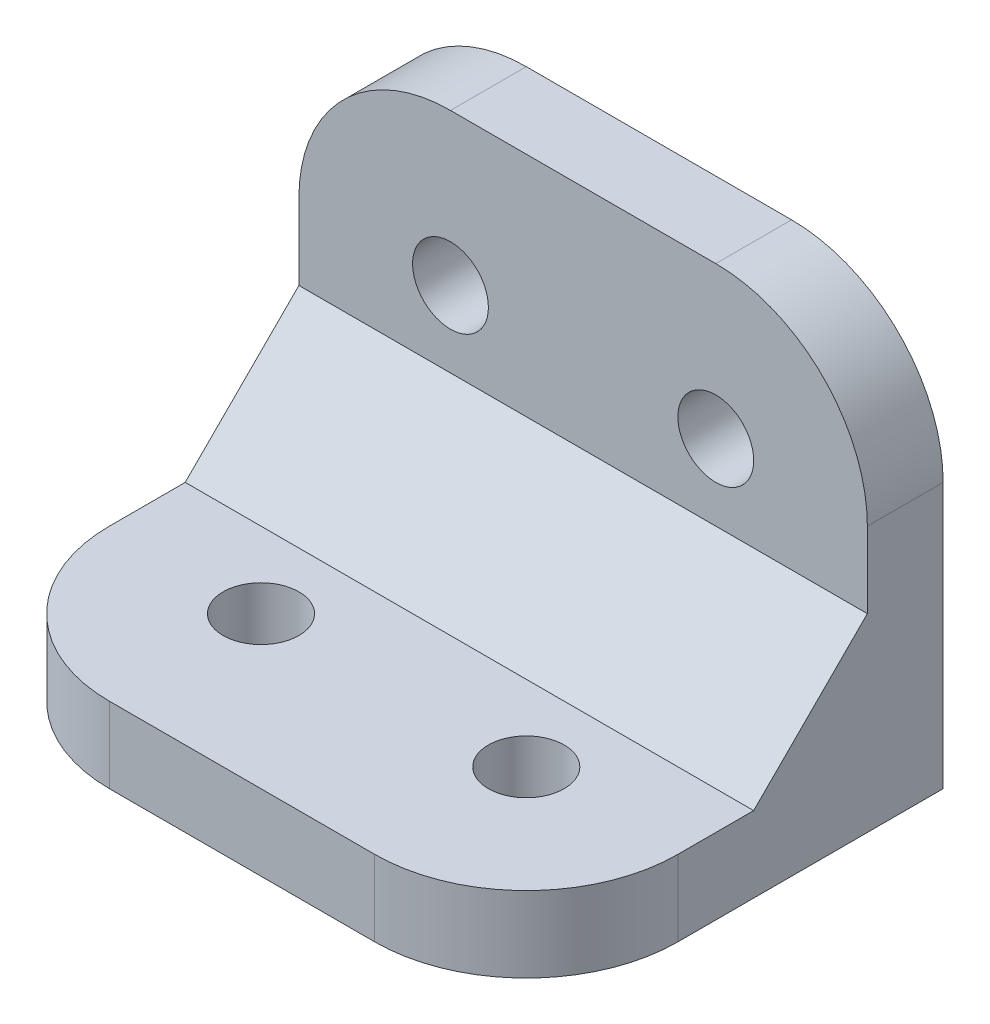
ISO-10303-21;
HEADER;
FILE_DESCRIPTION(('STEP AP214'),'2;1');
FILE_NAME('part.step','',(''),(''),'','','');
FILE_SCHEMA(('AUTOMOTIVE_DESIGN { 1 0 10303 214 1 1 1 1 }'));
ENDSEC;
DATA;
#1=APPLICATION_CONTEXT('core data for automotive mechanical design processes');
#2=APPLICATION_PROTOCOL_DEFINITION('international standard','automotive_design',2000,#1);
#3=PRODUCT_CONTEXT('',#1,'mechanical');
#4=PRODUCT('Part','Part','',(#3));
#5=PRODUCT_RELATED_PRODUCT_CATEGORY('part','',(#4));
#6=PRODUCT_DEFINITION_FORMATION('','',#4);
#7=PRODUCT_DEFINITION_CONTEXT('part definition',#1,'design');
#8=PRODUCT_DEFINITION('design','',#6,#7);
#9=PRODUCT_DEFINITION_SHAPE('','',#8);
#10=(LENGTH_UNIT() NAMED_UNIT(*) SI_UNIT(.MILLI.,.METRE.));
#11=(NAMED_UNIT(*) PLANE_ANGLE_UNIT() SI_UNIT($,.RADIAN.));
#12=(NAMED_UNIT(*) SI_UNIT($,.STERADIAN.) SOLID_ANGLE_UNIT());
#13=UNCERTAINTY_MEASURE_WITH_UNIT(LENGTH_MEASURE(1.E-05),#10,'distance_accuracy_value','');
#14=(GEOMETRIC_REPRESENTATION_CONTEXT(3) GLOBAL_UNCERTAINTY_ASSIGNED_CONTEXT((#13)) GLOBAL_UNIT_ASSIGNED_CONTEXT((#10,
#11,#12)) REPRESENTATION_CONTEXT('',''));
#15=CARTESIAN_POINT('',(0.,0.,0.));
#16=DIRECTION('',(0.,0.,1.));
#17=DIRECTION('',(1.,0.,0.));
#18=AXIS2_PLACEMENT_3D('',#15,#16,#17);
#19=CARTESIAN_POINT('',(0.,4.,0.));
#20=DIRECTION('',(1.,0.,0.));
#21=DIRECTION('',(0.,0.,-1.));
#22=AXIS2_PLACEMENT_3D('',#19,#20,#21);
#23=PLANE('',#22);
#24=DIRECTION('',(0.,0.,1.));
#25=VECTOR('',#24,1.);
#26=CARTESIAN_POINT('',(0.,0.,0.));
#27=LINE('',#26,#25);
#28=CARTESIAN_POINT('',(0.,0.,0.));
#29=VERTEX_POINT('',#28);
#30=CARTESIAN_POINT('',(0.,0.,14.));
#31=VERTEX_POINT('',#30);
#32=EDGE_CURVE('E147',#29,#31,#27,.T.);
#33=ORIENTED_EDGE('',*,*,#32,.T.);
#34=DIRECTION('',(0.,-1.,0.));
#35=VECTOR('',#34,1.);
#36=CARTESIAN_POINT('',(0.,4.,14.));
#37=LINE('',#36,#35);
#38=CARTESIAN_POINT('',(0.,4.,14.));
#39=VERTEX_POINT('',#38);
#40=EDGE_CURVE('E193',#31,#39,#37,.F.);
#41=ORIENTED_EDGE('',*,*,#40,.T.);
#42=DIRECTION('',(0.,0.,1.));
#43=VECTOR('',#42,1.);
#44=CARTESIAN_POINT('',(0.,4.,0.));
#45=LINE('',#44,#43);
#46=CARTESIAN_POINT('',(0.,4.,9.99999999999998));
#47=VERTEX_POINT('',#46);
#48=EDGE_CURVE('E148',#47,#39,#45,.T.);
#49=ORIENTED_EDGE('',*,*,#48,.F.);
#50=DIRECTION('',(0.,0.707106781186551,-0.707106781186544));
#51=VECTOR('',#50,1.);
#52=CARTESIAN_POINT('',(0.,8.99999999999999,5.00000000000004));
#53=LINE('',#52,#51);
#54=CARTESIAN_POINT('',(0.,10.,4.));
#55=VERTEX_POINT('',#54);
#56=EDGE_CURVE('E172',#47,#55,#53,.T.);
#57=ORIENTED_EDGE('',*,*,#56,.T.);
#58=DIRECTION('',(0.,-1.,0.));
#59=VECTOR('',#58,1.);
#60=CARTESIAN_POINT('',(0.,22.,4.));
#61=LINE('',#60,#59);
#62=CARTESIAN_POINT('',(0.,14.,4.));
#63=VERTEX_POINT('',#62);
#64=EDGE_CURVE('E206',#63,#55,#61,.T.);
#65=ORIENTED_EDGE('',*,*,#64,.F.);
#66=DIRECTION('',(0.,0.,1.));
#67=VECTOR('',#66,1.);
#68=CARTESIAN_POINT('',(0.,14.,0.));
#69=LINE('',#68,#67);
#70=CARTESIAN_POINT('',(0.,14.,0.));
#71=VERTEX_POINT('',#70);
#72=EDGE_CURVE('E191',#63,#71,#69,.F.);
#73=ORIENTED_EDGE('',*,*,#72,.T.);
#74=DIRECTION('',(0.,-1.,0.));
#75=VECTOR('',#74,1.);
#76=CARTESIAN_POINT('',(0.,4.,0.));
#77=LINE('',#76,#75);
#78=EDGE_CURVE('E133',#71,#29,#77,.T.);
#79=ORIENTED_EDGE('',*,*,#78,.T.);
#80=EDGE_LOOP('',(#33,#41,#49,#57,#65,#73,#79));
#81=FACE_BOUND('',#80,.T.);
#82=ADVANCED_FACE('F41',(#81),#23,.F.);
#83=CARTESIAN_POINT('',(0.,4.,22.));
#84=DIRECTION('',(0.,0.,-1.));
#85=DIRECTION('',(-1.,0.,0.));
#86=AXIS2_PLACEMENT_3D('',#83,#84,#85);
#87=PLANE('',#86);
#88=DIRECTION('',(1.,0.,0.));
#89=VECTOR('',#88,1.);
#90=CARTESIAN_POINT('',(0.,0.,22.));
#91=LINE('',#90,#89);
#92=CARTESIAN_POINT('',(8.,0.,22.));
#93=VERTEX_POINT('',#92);
#94=CARTESIAN_POINT('',(22.,0.,22.));
#95=VERTEX_POINT('',#94);
#96=EDGE_CURVE('E143',#93,#95,#91,.T.);
#97=ORIENTED_EDGE('',*,*,#96,.T.);
#98=DIRECTION('',(0.,-1.,0.));
#99=VECTOR('',#98,1.);
#100=CARTESIAN_POINT('',(22.,4.,22.));
#101=LINE('',#100,#99);
#102=CARTESIAN_POINT('',(22.,4.,22.));
#103=VERTEX_POINT('',#102);
#104=EDGE_CURVE('E185',#95,#103,#101,.F.);
#105=ORIENTED_EDGE('',*,*,#104,.T.);
#106=DIRECTION('',(1.,0.,0.));
#107=VECTOR('',#106,1.);
#108=CARTESIAN_POINT('',(0.,4.,22.));
#109=LINE('',#108,#107);
#110=CARTESIAN_POINT('',(8.,4.,22.));
#111=VERTEX_POINT('',#110);
#112=EDGE_CURVE('E151',#111,#103,#109,.T.);
#113=ORIENTED_EDGE('',*,*,#112,.F.);
#114=DIRECTION('',(0.,-1.,0.));
#115=VECTOR('',#114,1.);
#116=CARTESIAN_POINT('',(8.,4.,22.));
#117=LINE('',#116,#115);
#118=EDGE_CURVE('E182',#111,#93,#117,.T.);
#119=ORIENTED_EDGE('',*,*,#118,.T.);
#120=EDGE_LOOP('',(#97,#105,#113,#119));
#121=FACE_BOUND('',#120,.T.);
#122=ADVANCED_FACE('F232',(#121),#87,.F.);
#123=CARTESIAN_POINT('',(30.,4.,0.));
#124=DIRECTION('',(-1.,0.,0.));
#125=DIRECTION('',(0.,0.,1.));
#126=AXIS2_PLACEMENT_3D('',#123,#124,#125);
#127=PLANE('',#126);
#128=DIRECTION('',(0.,0.,-1.));
#129=VECTOR('',#128,1.);
#130=CARTESIAN_POINT('',(30.,4.,0.));
#131=LINE('',#130,#129);
#132=CARTESIAN_POINT('',(30.,4.,14.));
#133=VERTEX_POINT('',#132);
#134=CARTESIAN_POINT('',(30.,4.,9.99999999999998));
#135=VERTEX_POINT('',#134);
#136=EDGE_CURVE('E155',#133,#135,#131,.T.);
#137=ORIENTED_EDGE('',*,*,#136,.F.);
#138=DIRECTION('',(0.,-1.,0.));
#139=VECTOR('',#138,1.);
#140=CARTESIAN_POINT('',(30.,4.,14.));
#141=LINE('',#140,#139);
#142=CARTESIAN_POINT('',(30.,0.,14.));
#143=VERTEX_POINT('',#142);
#144=EDGE_CURVE('E141',#133,#143,#141,.T.);
#145=ORIENTED_EDGE('',*,*,#144,.T.);
#146=DIRECTION('',(0.,0.,-1.));
#147=VECTOR('',#146,1.);
#148=CARTESIAN_POINT('',(30.,0.,0.));
#149=LINE('',#148,#147);
#150=CARTESIAN_POINT('',(30.,0.,0.));
#151=VERTEX_POINT('',#150);
#152=EDGE_CURVE('E137',#143,#151,#149,.T.);
#153=ORIENTED_EDGE('',*,*,#152,.T.);
#154=DIRECTION('',(0.,-1.,0.));
#155=VECTOR('',#154,1.);
#156=CARTESIAN_POINT('',(30.,4.,0.));
#157=LINE('',#156,#155);
#158=CARTESIAN_POINT('',(30.,14.,0.));
#159=VERTEX_POINT('',#158);
#160=EDGE_CURVE('E125',#159,#151,#157,.T.);
#161=ORIENTED_EDGE('',*,*,#160,.F.);
#162=DIRECTION('',(0.,0.,-1.));
#163=VECTOR('',#162,1.);
#164=CARTESIAN_POINT('',(30.,14.,4.));
#165=LINE('',#164,#163);
#166=CARTESIAN_POINT('',(30.,14.,4.));
#167=VERTEX_POINT('',#166);
#168=EDGE_CURVE('E175',#159,#167,#165,.F.);
#169=ORIENTED_EDGE('',*,*,#168,.T.);
#170=DIRECTION('',(0.,-1.,0.));
#171=VECTOR('',#170,1.);
#172=CARTESIAN_POINT('',(30.,22.,4.));
#173=LINE('',#172,#171);
#174=CARTESIAN_POINT('',(30.,10.,4.));
#175=VERTEX_POINT('',#174);
#176=EDGE_CURVE('E215',#167,#175,#173,.T.);
#177=ORIENTED_EDGE('',*,*,#176,.T.);
#178=DIRECTION('',(0.,-0.707106781186551,0.707106781186544));
#179=VECTOR('',#178,1.);
#180=CARTESIAN_POINT('',(30.,8.99999999999999,5.00000000000004));
#181=LINE('',#180,#179);
#182=EDGE_CURVE('E169',#175,#135,#181,.T.);
#183=ORIENTED_EDGE('',*,*,#182,.T.);
#184=EDGE_LOOP('',(#137,#145,#153,#161,#169,#177,#183));
#185=FACE_BOUND('',#184,.T.);
#186=ADVANCED_FACE('F139',(#185),#127,.F.);
#187=CARTESIAN_POINT('',(0.,4.,0.));
#188=DIRECTION('',(0.,0.,1.));
#189=DIRECTION('',(1.,0.,0.));
#190=AXIS2_PLACEMENT_3D('',#187,#188,#189);
#191=PLANE('',#190);
#192=CARTESIAN_POINT('',(8.,14.,0.));
#193=DIRECTION('',(0.,0.,1.));
#194=DIRECTION('',(1.,0.,0.));
#195=AXIS2_PLACEMENT_3D('',#192,#193,#194);
#196=CIRCLE('',#195,2.);
#197=CARTESIAN_POINT('',(10.,14.,0.));
#198=VERTEX_POINT('',#197);
#199=EDGE_CURVE('E412',#198,#198,#196,.T.);
#200=ORIENTED_EDGE('',*,*,#199,.T.);
#201=EDGE_LOOP('',(#200));
#202=FACE_BOUND('',#201,.T.);
#203=CARTESIAN_POINT('',(22.,14.,0.));
#204=DIRECTION('',(0.,0.,1.));
#205=DIRECTION('',(1.,0.,0.));
#206=AXIS2_PLACEMENT_3D('',#203,#204,#205);
#207=CIRCLE('',#206,2.);
#208=CARTESIAN_POINT('',(24.,14.,0.));
#209=VERTEX_POINT('',#208);
#210=EDGE_CURVE('E415',#209,#209,#207,.T.);
#211=ORIENTED_EDGE('',*,*,#210,.T.);
#212=EDGE_LOOP('',(#211));
#213=FACE_BOUND('',#212,.T.);
#214=DIRECTION('',(-1.,0.,0.));
#215=VECTOR('',#214,1.);
#216=CARTESIAN_POINT('',(0.,22.,0.));
#217=LINE('',#216,#215);
#218=CARTESIAN_POINT('',(22.,22.,0.));
#219=VERTEX_POINT('',#218);
#220=CARTESIAN_POINT('',(8.,22.,0.));
#221=VERTEX_POINT('',#220);
#222=EDGE_CURVE('E219',#219,#221,#217,.T.);
#223=ORIENTED_EDGE('',*,*,#222,.F.);
#224=CARTESIAN_POINT('',(22.,14.,0.));
#225=DIRECTION('',(0.,0.,1.));
#226=DIRECTION('',(1.,0.,0.));
#227=AXIS2_PLACEMENT_3D('',#224,#225,#226);
#228=CIRCLE('',#227,8.);
#229=EDGE_CURVE('E64',#219,#159,#228,.F.);
#230=ORIENTED_EDGE('',*,*,#229,.T.);
#231=ORIENTED_EDGE('',*,*,#160,.T.);
#232=DIRECTION('',(-1.,0.,0.));
#233=VECTOR('',#232,1.);
#234=CARTESIAN_POINT('',(0.,0.,0.));
#235=LINE('',#234,#233);
#236=EDGE_CURVE('E129',#151,#29,#235,.T.);
#237=ORIENTED_EDGE('',*,*,#236,.T.);
#238=ORIENTED_EDGE('',*,*,#78,.F.);
#239=CARTESIAN_POINT('',(8.,14.,0.));
#240=DIRECTION('',(0.,0.,1.));
#241=DIRECTION('',(1.,0.,0.));
#242=AXIS2_PLACEMENT_3D('',#239,#240,#241);
#243=CIRCLE('',#242,8.);
#244=EDGE_CURVE('E56',#71,#221,#243,.F.);
#245=ORIENTED_EDGE('',*,*,#244,.T.);
#246=EDGE_LOOP('',(#223,#230,#231,#237,#238,#245));
#247=FACE_BOUND('',#246,.T.);
#248=ADVANCED_FACE('F127',(#202,#213,#247),#191,.F.);
#249=CARTESIAN_POINT('',(0.,4.,0.));
#250=DIRECTION('',(0.,1.,0.));
#251=DIRECTION('',(0.,0.,1.));
#252=AXIS2_PLACEMENT_3D('',#249,#250,#251);
#253=PLANE('',#252);
#254=CARTESIAN_POINT('',(8.,4.,14.));
#255=DIRECTION('',(0.,1.,0.));
#256=DIRECTION('',(0.,0.,1.));
#257=AXIS2_PLACEMENT_3D('',#254,#255,#256);
#258=CIRCLE('',#257,2.);
#259=CARTESIAN_POINT('',(8.,4.,16.));
#260=VERTEX_POINT('',#259);
#261=EDGE_CURVE('E161',#260,#260,#258,.T.);
#262=ORIENTED_EDGE('',*,*,#261,.F.);
#263=EDGE_LOOP('',(#262));
#264=FACE_BOUND('',#263,.T.);
#265=CARTESIAN_POINT('',(22.,4.,14.));
#266=DIRECTION('',(0.,1.,0.));
#267=DIRECTION('',(0.,0.,1.));
#268=AXIS2_PLACEMENT_3D('',#265,#266,#267);
#269=CIRCLE('',#268,2.);
#270=CARTESIAN_POINT('',(22.,4.,16.));
#271=VERTEX_POINT('',#270);
#272=EDGE_CURVE('E419',#271,#271,#269,.T.);
#273=ORIENTED_EDGE('',*,*,#272,.F.);
#274=EDGE_LOOP('',(#273));
#275=FACE_BOUND('',#274,.T.);
#276=ORIENTED_EDGE('',*,*,#112,.T.);
#277=CARTESIAN_POINT('',(22.,4.,14.));
#278=DIRECTION('',(0.,1.,0.));
#279=DIRECTION('',(0.,0.,1.));
#280=AXIS2_PLACEMENT_3D('',#277,#278,#279);
#281=CIRCLE('',#280,8.);
#282=EDGE_CURVE('E189',#103,#133,#281,.T.);
#283=ORIENTED_EDGE('',*,*,#282,.T.);
#284=ORIENTED_EDGE('',*,*,#136,.T.);
#285=DIRECTION('',(-1.,0.,0.));
#286=VECTOR('',#285,1.);
#287=CARTESIAN_POINT('',(0.,4.,9.99999999999998));
#288=LINE('',#287,#286);
#289=EDGE_CURVE('E167',#135,#47,#288,.T.);
#290=ORIENTED_EDGE('',*,*,#289,.T.);
#291=ORIENTED_EDGE('',*,*,#48,.T.);
#292=CARTESIAN_POINT('',(8.,4.,14.));
#293=DIRECTION('',(0.,1.,0.));
#294=DIRECTION('',(0.,0.,1.));
#295=AXIS2_PLACEMENT_3D('',#292,#293,#294);
#296=CIRCLE('',#295,8.);
#297=EDGE_CURVE('E187',#39,#111,#296,.T.);
#298=ORIENTED_EDGE('',*,*,#297,.T.);
#299=EDGE_LOOP('',(#276,#283,#284,#290,#291,#298));
#300=FACE_BOUND('',#299,.T.);
#301=ADVANCED_FACE('F239',(#264,#275,#300),#253,.T.);
#302=CARTESIAN_POINT('',(0.,0.,0.));
#303=DIRECTION('',(0.,1.,0.));
#304=DIRECTION('',(0.,0.,1.));
#305=AXIS2_PLACEMENT_3D('',#302,#303,#304);
#306=PLANE('',#305);
#307=CARTESIAN_POINT('',(8.,0.,14.));
#308=DIRECTION('',(0.,1.,0.));
#309=DIRECTION('',(0.,0.,1.));
#310=AXIS2_PLACEMENT_3D('',#307,#308,#309);
#311=CIRCLE('',#310,2.);
#312=CARTESIAN_POINT('',(8.,0.,16.));
#313=VERTEX_POINT('',#312);
#314=EDGE_CURVE('E160',#313,#313,#311,.T.);
#315=ORIENTED_EDGE('',*,*,#314,.T.);
#316=EDGE_LOOP('',(#315));
#317=FACE_BOUND('',#316,.T.);
#318=CARTESIAN_POINT('',(22.,0.,14.));
#319=DIRECTION('',(0.,1.,0.));
#320=DIRECTION('',(0.,0.,1.));
#321=AXIS2_PLACEMENT_3D('',#318,#319,#320);
#322=CIRCLE('',#321,2.);
#323=CARTESIAN_POINT('',(22.,0.,16.));
#324=VERTEX_POINT('',#323);
#325=EDGE_CURVE('E157',#324,#324,#322,.T.);
#326=ORIENTED_EDGE('',*,*,#325,.T.);
#327=EDGE_LOOP('',(#326));
#328=FACE_BOUND('',#327,.T.);
#329=ORIENTED_EDGE('',*,*,#152,.F.);
#330=CARTESIAN_POINT('',(22.,0.,14.));
#331=DIRECTION('',(0.,1.,0.));
#332=DIRECTION('',(0.,0.,1.));
#333=AXIS2_PLACEMENT_3D('',#330,#331,#332);
#334=CIRCLE('',#333,8.);
#335=EDGE_CURVE('E180',#143,#95,#334,.F.);
#336=ORIENTED_EDGE('',*,*,#335,.T.);
#337=ORIENTED_EDGE('',*,*,#96,.F.);
#338=CARTESIAN_POINT('',(8.,0.,14.));
#339=DIRECTION('',(0.,1.,0.));
#340=DIRECTION('',(0.,0.,1.));
#341=AXIS2_PLACEMENT_3D('',#338,#339,#340);
#342=CIRCLE('',#341,8.);
#343=EDGE_CURVE('E178',#93,#31,#342,.F.);
#344=ORIENTED_EDGE('',*,*,#343,.T.);
#345=ORIENTED_EDGE('',*,*,#32,.F.);
#346=ORIENTED_EDGE('',*,*,#236,.F.);
#347=EDGE_LOOP('',(#329,#336,#337,#344,#345,#346));
#348=FACE_BOUND('',#347,.T.);
#349=ADVANCED_FACE('F145',(#317,#328,#348),#306,.F.);
#350=CARTESIAN_POINT('',(0.,22.,4.));
#351=DIRECTION('',(0.,0.,-1.));
#352=DIRECTION('',(-1.,0.,0.));
#353=AXIS2_PLACEMENT_3D('',#350,#351,#352);
#354=PLANE('',#353);
#355=CARTESIAN_POINT('',(8.,14.,4.));
#356=DIRECTION('',(0.,0.,1.));
#357=DIRECTION('',(1.,0.,0.));
#358=AXIS2_PLACEMENT_3D('',#355,#356,#357);
#359=CIRCLE('',#358,2.);
#360=CARTESIAN_POINT('',(10.,14.,4.));
#361=VERTEX_POINT('',#360);
#362=EDGE_CURVE('E417',#361,#361,#359,.T.);
#363=ORIENTED_EDGE('',*,*,#362,.F.);
#364=EDGE_LOOP('',(#363));
#365=FACE_BOUND('',#364,.T.);
#366=CARTESIAN_POINT('',(22.,14.,4.));
#367=DIRECTION('',(0.,0.,1.));
#368=DIRECTION('',(1.,0.,0.));
#369=AXIS2_PLACEMENT_3D('',#366,#367,#368);
#370=CIRCLE('',#369,2.);
#371=CARTESIAN_POINT('',(24.,14.,4.));
#372=VERTEX_POINT('',#371);
#373=EDGE_CURVE('E421',#372,#372,#370,.T.);
#374=ORIENTED_EDGE('',*,*,#373,.F.);
#375=EDGE_LOOP('',(#374));
#376=FACE_BOUND('',#375,.T.);
#377=ORIENTED_EDGE('',*,*,#176,.F.);
#378=CARTESIAN_POINT('',(22.,14.,4.));
#379=DIRECTION('',(0.,0.,-1.));
#380=DIRECTION('',(-1.,0.,0.));
#381=AXIS2_PLACEMENT_3D('',#378,#379,#380);
#382=CIRCLE('',#381,8.);
#383=CARTESIAN_POINT('',(22.,22.,4.));
#384=VERTEX_POINT('',#383);
#385=EDGE_CURVE('E11',#167,#384,#382,.F.);
#386=ORIENTED_EDGE('',*,*,#385,.T.);
#387=DIRECTION('',(1.,0.,0.));
#388=VECTOR('',#387,1.);
#389=CARTESIAN_POINT('',(0.,22.,4.));
#390=LINE('',#389,#388);
#391=CARTESIAN_POINT('',(8.,22.,4.));
#392=VERTEX_POINT('',#391);
#393=EDGE_CURVE('E164',#392,#384,#390,.T.);
#394=ORIENTED_EDGE('',*,*,#393,.F.);
#395=CARTESIAN_POINT('',(8.,14.,4.));
#396=DIRECTION('',(0.,0.,-1.));
#397=DIRECTION('',(-1.,0.,0.));
#398=AXIS2_PLACEMENT_3D('',#395,#396,#397);
#399=CIRCLE('',#398,8.);
#400=EDGE_CURVE('E49',#392,#63,#399,.F.);
#401=ORIENTED_EDGE('',*,*,#400,.T.);
#402=ORIENTED_EDGE('',*,*,#64,.T.);
#403=DIRECTION('',(1.,0.,0.));
#404=VECTOR('',#403,1.);
#405=CARTESIAN_POINT('',(0.,10.,4.));
#406=LINE('',#405,#404);
#407=EDGE_CURVE('E132',#55,#175,#406,.T.);
#408=ORIENTED_EDGE('',*,*,#407,.T.);
#409=EDGE_LOOP('',(#377,#386,#394,#401,#402,#408));
#410=FACE_BOUND('',#409,.T.);
#411=ADVANCED_FACE('F205',(#365,#376,#410),#354,.F.);
#412=CARTESIAN_POINT('',(0.,22.,0.));
#413=DIRECTION('',(0.,1.,0.));
#414=DIRECTION('',(0.,0.,1.));
#415=AXIS2_PLACEMENT_3D('',#412,#413,#414);
#416=PLANE('',#415);
#417=ORIENTED_EDGE('',*,*,#393,.T.);
#418=DIRECTION('',(0.,0.,-1.));
#419=VECTOR('',#418,1.);
#420=CARTESIAN_POINT('',(22.,22.,0.));
#421=LINE('',#420,#419);
#422=EDGE_CURVE('E198',#384,#219,#421,.T.);
#423=ORIENTED_EDGE('',*,*,#422,.T.);
#424=ORIENTED_EDGE('',*,*,#222,.T.);
#425=DIRECTION('',(0.,0.,1.));
#426=VECTOR('',#425,1.);
#427=CARTESIAN_POINT('',(8.,22.,4.));
#428=LINE('',#427,#426);
#429=EDGE_CURVE('E195',#221,#392,#428,.T.);
#430=ORIENTED_EDGE('',*,*,#429,.T.);
#431=EDGE_LOOP('',(#417,#423,#424,#430));
#432=FACE_BOUND('',#431,.T.);
#433=ADVANCED_FACE('F218',(#432),#416,.T.);
#434=CARTESIAN_POINT('',(22.,-16.,14.));
#435=DIRECTION('',(0.,1.,0.));
#436=DIRECTION('',(0.,0.,1.));
#437=AXIS2_PLACEMENT_3D('',#434,#435,#436);
#438=CYLINDRICAL_SURFACE('',#437,2.);
#439=ORIENTED_EDGE('',*,*,#272,.T.);
#440=EDGE_LOOP('',(#439));
#441=FACE_BOUND('',#440,.T.);
#442=ORIENTED_EDGE('',*,*,#325,.F.);
#443=EDGE_LOOP('',(#442));
#444=FACE_BOUND('',#443,.T.);
#445=ADVANCED_FACE('F286',(#441,#444),#438,.F.);
#446=CARTESIAN_POINT('',(8.,-16.,14.));
#447=DIRECTION('',(0.,1.,0.));
#448=DIRECTION('',(0.,0.,1.));
#449=AXIS2_PLACEMENT_3D('',#446,#447,#448);
#450=CYLINDRICAL_SURFACE('',#449,2.);
#451=ORIENTED_EDGE('',*,*,#261,.T.);
#452=EDGE_LOOP('',(#451));
#453=FACE_BOUND('',#452,.T.);
#454=ORIENTED_EDGE('',*,*,#314,.F.);
#455=EDGE_LOOP('',(#454));
#456=FACE_BOUND('',#455,.T.);
#457=ADVANCED_FACE('F278',(#453,#456),#450,.F.);
#458=CARTESIAN_POINT('',(22.,14.,-16.));
#459=DIRECTION('',(0.,0.,1.));
#460=DIRECTION('',(1.,0.,0.));
#461=AXIS2_PLACEMENT_3D('',#458,#459,#460);
#462=CYLINDRICAL_SURFACE('',#461,2.);
#463=ORIENTED_EDGE('',*,*,#373,.T.);
#464=EDGE_LOOP('',(#463));
#465=FACE_BOUND('',#464,.T.);
#466=ORIENTED_EDGE('',*,*,#210,.F.);
#467=EDGE_LOOP('',(#466));
#468=FACE_BOUND('',#467,.T.);
#469=ADVANCED_FACE('F272',(#465,#468),#462,.F.);
#470=CARTESIAN_POINT('',(8.,14.,-16.));
#471=DIRECTION('',(0.,0.,1.));
#472=DIRECTION('',(1.,0.,0.));
#473=AXIS2_PLACEMENT_3D('',#470,#471,#472);
#474=CYLINDRICAL_SURFACE('',#473,2.);
#475=ORIENTED_EDGE('',*,*,#362,.T.);
#476=EDGE_LOOP('',(#475));
#477=FACE_BOUND('',#476,.T.);
#478=ORIENTED_EDGE('',*,*,#199,.F.);
#479=EDGE_LOOP('',(#478));
#480=FACE_BOUND('',#479,.T.);
#481=ADVANCED_FACE('F268',(#477,#480),#474,.F.);
#482=CARTESIAN_POINT('',(0.,10.,4.));
#483=DIRECTION('',(0.,-0.707106781186544,-0.707106781186551));
#484=DIRECTION('',(1.,0.,0.));
#485=AXIS2_PLACEMENT_3D('',#482,#483,#484);
#486=PLANE('',#485);
#487=ORIENTED_EDGE('',*,*,#56,.F.);
#488=ORIENTED_EDGE('',*,*,#289,.F.);
#489=ORIENTED_EDGE('',*,*,#182,.F.);
#490=ORIENTED_EDGE('',*,*,#407,.F.);
#491=EDGE_LOOP('',(#487,#488,#489,#490));
#492=FACE_BOUND('',#491,.T.);
#493=ADVANCED_FACE('F243',(#492),#486,.F.);
#494=CARTESIAN_POINT('',(22.,4.,14.));
#495=DIRECTION('',(0.,-1.,0.));
#496=DIRECTION('',(0.,0.,-1.));
#497=AXIS2_PLACEMENT_3D('',#494,#495,#496);
#498=CYLINDRICAL_SURFACE('',#497,8.);
#499=ORIENTED_EDGE('',*,*,#282,.F.);
#500=ORIENTED_EDGE('',*,*,#104,.F.);
#501=ORIENTED_EDGE('',*,*,#335,.F.);
#502=ORIENTED_EDGE('',*,*,#144,.F.);
#503=EDGE_LOOP('',(#499,#500,#501,#502));
#504=FACE_BOUND('',#503,.T.);
#505=ADVANCED_FACE('F237',(#504),#498,.T.);
#506=CARTESIAN_POINT('',(8.,4.,14.));
#507=DIRECTION('',(0.,-1.,0.));
#508=DIRECTION('',(0.,0.,-1.));
#509=AXIS2_PLACEMENT_3D('',#506,#507,#508);
#510=CYLINDRICAL_SURFACE('',#509,8.);
#511=ORIENTED_EDGE('',*,*,#297,.F.);
#512=ORIENTED_EDGE('',*,*,#40,.F.);
#513=ORIENTED_EDGE('',*,*,#343,.F.);
#514=ORIENTED_EDGE('',*,*,#118,.F.);
#515=EDGE_LOOP('',(#511,#512,#513,#514));
#516=FACE_BOUND('',#515,.T.);
#517=ADVANCED_FACE('F247',(#516),#510,.T.);
#518=CARTESIAN_POINT('',(22.,14.,0.));
#519=DIRECTION('',(0.,0.,1.));
#520=DIRECTION('',(1.,0.,0.));
#521=AXIS2_PLACEMENT_3D('',#518,#519,#520);
#522=CYLINDRICAL_SURFACE('',#521,8.);
#523=ORIENTED_EDGE('',*,*,#385,.F.);
#524=ORIENTED_EDGE('',*,*,#168,.F.);
#525=ORIENTED_EDGE('',*,*,#229,.F.);
#526=ORIENTED_EDGE('',*,*,#422,.F.);
#527=EDGE_LOOP('',(#523,#524,#525,#526));
#528=FACE_BOUND('',#527,.T.);
#529=ADVANCED_FACE('F249',(#528),#522,.T.);
#530=CARTESIAN_POINT('',(8.,14.,0.));
#531=DIRECTION('',(0.,0.,-1.));
#532=DIRECTION('',(-1.,0.,0.));
#533=AXIS2_PLACEMENT_3D('',#530,#531,#532);
#534=CYLINDRICAL_SURFACE('',#533,8.);
#535=ORIENTED_EDGE('',*,*,#244,.F.);
#536=ORIENTED_EDGE('',*,*,#72,.F.);
#537=ORIENTED_EDGE('',*,*,#400,.F.);
#538=ORIENTED_EDGE('',*,*,#429,.F.);
#539=EDGE_LOOP('',(#535,#536,#537,#538));
#540=FACE_BOUND('',#539,.T.);
#541=ADVANCED_FACE('F43',(#540),#534,.T.);
#542=CLOSED_SHELL('',(#82,#122,#186,#248,#301,#349,#411,#433,#445,#457,#469,#481,#493,#505,#517,
#529,#541));
#543=MANIFOLD_SOLID_BREP('B2',#542);
#544=ADVANCED_BREP_SHAPE_REPRESENTATION('',(#18,#543),#14);
#545=SHAPE_DEFINITION_REPRESENTATION(#9,#544);
ENDSEC;
END-ISO-10303-21;
